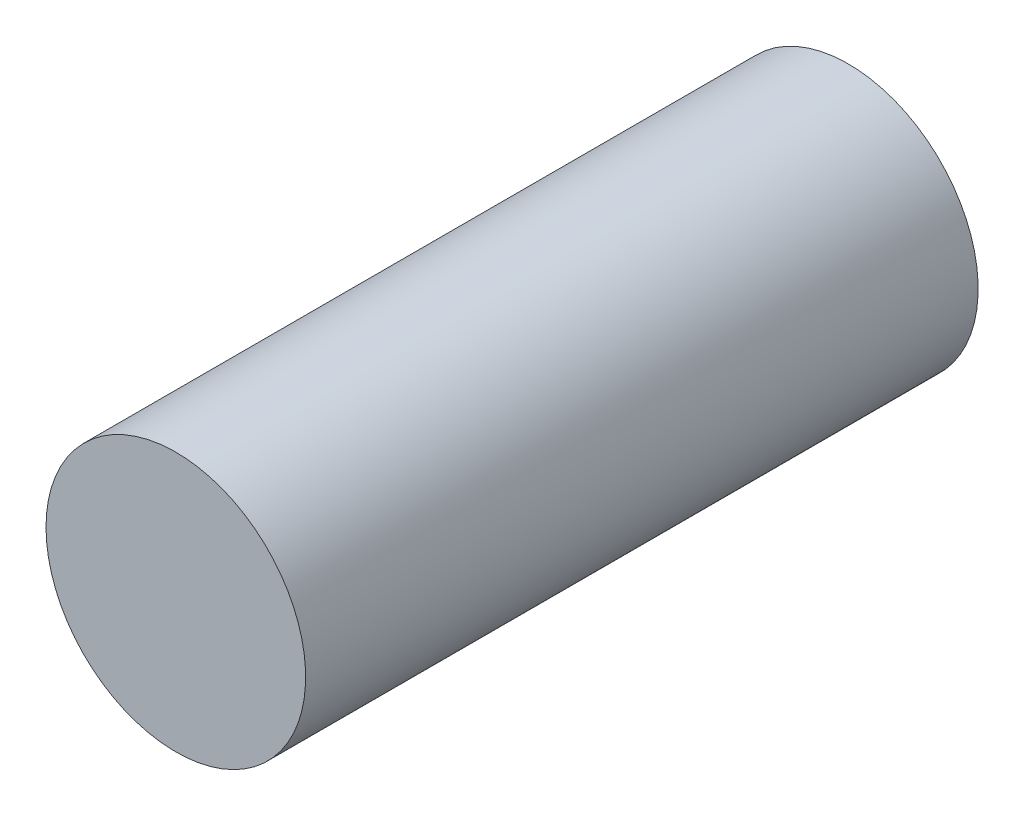
ISO-10303-21;
HEADER;
FILE_DESCRIPTION(('STEP AP214'),'2;1');
FILE_NAME('part.step','',(''),(''),'','','');
FILE_SCHEMA(('AUTOMOTIVE_DESIGN { 1 0 10303 214 1 1 1 1 }'));
ENDSEC;
DATA;
#1=APPLICATION_CONTEXT('core data for automotive mechanical design processes');
#2=APPLICATION_PROTOCOL_DEFINITION('international standard','automotive_design',2000,#1);
#3=PRODUCT_CONTEXT('',#1,'mechanical');
#4=PRODUCT('Part','Part','',(#3));
#5=PRODUCT_RELATED_PRODUCT_CATEGORY('part','',(#4));
#6=PRODUCT_DEFINITION_FORMATION('','',#4);
#7=PRODUCT_DEFINITION_CONTEXT('part definition',#1,'design');
#8=PRODUCT_DEFINITION('design','',#6,#7);
#9=PRODUCT_DEFINITION_SHAPE('','',#8);
#10=(LENGTH_UNIT() NAMED_UNIT(*) SI_UNIT(.MILLI.,.METRE.));
#11=(NAMED_UNIT(*) PLANE_ANGLE_UNIT() SI_UNIT($,.RADIAN.));
#12=(NAMED_UNIT(*) SI_UNIT($,.STERADIAN.) SOLID_ANGLE_UNIT());
#13=UNCERTAINTY_MEASURE_WITH_UNIT(LENGTH_MEASURE(1.E-05),#10,'distance_accuracy_value','');
#14=(GEOMETRIC_REPRESENTATION_CONTEXT(3) GLOBAL_UNCERTAINTY_ASSIGNED_CONTEXT((#13)) GLOBAL_UNIT_ASSIGNED_CONTEXT((#10,
#11,#12)) REPRESENTATION_CONTEXT('',''));
#15=CARTESIAN_POINT('',(0.,0.,0.));
#16=DIRECTION('',(0.,0.,1.));
#17=DIRECTION('',(1.,0.,0.));
#18=AXIS2_PLACEMENT_3D('',#15,#16,#17);
#19=CARTESIAN_POINT('',(0.,0.,51.8));
#20=DIRECTION('',(0.,0.,-1.));
#21=DIRECTION('',(-1.,0.,0.));
#22=AXIS2_PLACEMENT_3D('',#19,#20,#21);
#23=CYLINDRICAL_SURFACE('',#22,10.);
#24=CARTESIAN_POINT('',(0.,0.,51.8));
#25=DIRECTION('',(0.,0.,1.));
#26=DIRECTION('',(1.,0.,0.));
#27=AXIS2_PLACEMENT_3D('',#24,#25,#26);
#28=CIRCLE('',#27,10.);
#29=CARTESIAN_POINT('',(-10.,0.,51.8));
#30=VERTEX_POINT('',#29);
#31=EDGE_CURVE('E10',#30,#30,#28,.T.);
#32=CARTESIAN_POINT('',(0.,0.,0.));
#33=DIRECTION('',(0.,0.,1.));
#34=DIRECTION('',(1.,0.,0.));
#35=AXIS2_PLACEMENT_3D('',#32,#33,#34);
#36=CIRCLE('',#35,10.);
#37=CARTESIAN_POINT('',(-10.,0.,0.));
#38=VERTEX_POINT('',#37);
#39=EDGE_CURVE('E46',#38,#38,#36,.T.);
#40=CARTESIAN_POINT('',(-10.,0.,51.8));
#41=CARTESIAN_POINT('',(-10.,0.,51.2604166666667));
#42=CARTESIAN_POINT('',(-10.,0.,50.7208333333333));
#43=CARTESIAN_POINT('',(-10.,0.,49.6416666666667));
#44=CARTESIAN_POINT('',(-10.,0.,49.1020833333333));
#45=CARTESIAN_POINT('',(-10.,0.,48.0229166666667));
#46=CARTESIAN_POINT('',(-10.,0.,47.4833333333333));
#47=CARTESIAN_POINT('',(-10.,0.,46.4041666666667));
#48=CARTESIAN_POINT('',(-10.,0.,45.8645833333333));
#49=CARTESIAN_POINT('',(-10.,0.,44.7854166666667));
#50=CARTESIAN_POINT('',(-10.,0.,44.2458333333333));
#51=CARTESIAN_POINT('',(-10.,0.,43.1666666666667));
#52=CARTESIAN_POINT('',(-10.,0.,42.6270833333333));
#53=CARTESIAN_POINT('',(-10.,0.,41.5479166666667));
#54=CARTESIAN_POINT('',(-10.,0.,41.0083333333333));
#55=CARTESIAN_POINT('',(-10.,0.,39.9291666666667));
#56=CARTESIAN_POINT('',(-10.,0.,39.3895833333333));
#57=CARTESIAN_POINT('',(-10.,0.,38.3104166666667));
#58=CARTESIAN_POINT('',(-10.,0.,37.7708333333333));
#59=CARTESIAN_POINT('',(-10.,0.,36.6916666666667));
#60=CARTESIAN_POINT('',(-10.,0.,36.1520833333333));
#61=CARTESIAN_POINT('',(-10.,0.,35.0729166666667));
#62=CARTESIAN_POINT('',(-10.,0.,34.5333333333333));
#63=CARTESIAN_POINT('',(-10.,0.,33.4541666666667));
#64=CARTESIAN_POINT('',(-10.,0.,32.9145833333333));
#65=CARTESIAN_POINT('',(-10.,0.,31.8354166666667));
#66=CARTESIAN_POINT('',(-10.,0.,31.2958333333333));
#67=CARTESIAN_POINT('',(-10.,0.,30.2166666666667));
#68=CARTESIAN_POINT('',(-10.,0.,29.6770833333333));
#69=CARTESIAN_POINT('',(-10.,0.,28.5979166666667));
#70=CARTESIAN_POINT('',(-10.,0.,28.0583333333333));
#71=CARTESIAN_POINT('',(-10.,0.,26.9791666666667));
#72=CARTESIAN_POINT('',(-10.,0.,26.4395833333333));
#73=CARTESIAN_POINT('',(-10.,0.,25.3604166666667));
#74=CARTESIAN_POINT('',(-10.,0.,24.8208333333333));
#75=CARTESIAN_POINT('',(-10.,0.,23.7416666666667));
#76=CARTESIAN_POINT('',(-10.,0.,23.2020833333333));
#77=CARTESIAN_POINT('',(-10.,0.,22.1229166666667));
#78=CARTESIAN_POINT('',(-10.,0.,21.5833333333333));
#79=CARTESIAN_POINT('',(-10.,0.,20.5041666666667));
#80=CARTESIAN_POINT('',(-10.,0.,19.9645833333333));
#81=CARTESIAN_POINT('',(-10.,0.,18.8854166666667));
#82=CARTESIAN_POINT('',(-10.,0.,18.3458333333333));
#83=CARTESIAN_POINT('',(-10.,0.,17.2666666666667));
#84=CARTESIAN_POINT('',(-10.,0.,16.7270833333333));
#85=CARTESIAN_POINT('',(-10.,0.,15.6479166666667));
#86=CARTESIAN_POINT('',(-10.,0.,15.1083333333333));
#87=CARTESIAN_POINT('',(-10.,0.,14.0291666666667));
#88=CARTESIAN_POINT('',(-10.,0.,13.4895833333333));
#89=CARTESIAN_POINT('',(-10.,0.,12.4104166666667));
#90=CARTESIAN_POINT('',(-10.,0.,11.8708333333333));
#91=CARTESIAN_POINT('',(-10.,0.,10.7916666666667));
#92=CARTESIAN_POINT('',(-10.,0.,10.2520833333333));
#93=CARTESIAN_POINT('',(-10.,0.,9.17291666666666));
#94=CARTESIAN_POINT('',(-10.,0.,8.63333333333333));
#95=CARTESIAN_POINT('',(-10.,0.,7.55416666666666));
#96=CARTESIAN_POINT('',(-10.,0.,7.01458333333333));
#97=CARTESIAN_POINT('',(-10.,0.,5.93541666666666));
#98=CARTESIAN_POINT('',(-10.,0.,5.39583333333333));
#99=CARTESIAN_POINT('',(-10.,0.,4.31666666666666));
#100=CARTESIAN_POINT('',(-10.,0.,3.77708333333333));
#101=CARTESIAN_POINT('',(-10.,0.,2.69791666666666));
#102=CARTESIAN_POINT('',(-10.,0.,2.15833333333333));
#103=CARTESIAN_POINT('',(-10.,0.,1.07916666666666));
#104=CARTESIAN_POINT('',(-10.,0.,0.539583333333327));
#105=CARTESIAN_POINT('',(-10.,0.,0.));
#106=B_SPLINE_CURVE_WITH_KNOTS('',3,(#40,#41,#42,#43,#44,#45,#46,#47,#48,#49,#50,#51,#52,#53,
#54,#55,#56,#57,#58,#59,#60,#61,#62,#63,#64,#65,#66,#67,#68,#69,#70,#71,#72,#73,#74,#75,#76,#77,
#78,#79,#80,#81,#82,#83,#84,#85,#86,#87,#88,#89,#90,#91,#92,#93,#94,#95,#96,#97,#98,#99,#100,
#101,#102,#103,#104,#105),.UNSPECIFIED.,.F.,.F.,(4,2,2,2,2,2,2,2,2,2,2,2,2,2,2,2,2,2,2,2,2,2,2,
2,2,2,2,2,2,2,2,2,4),(0.,1.61875,3.2375,4.85625000000001,6.475,8.09375,9.71250000000001,
11.33125,12.95,14.56875,16.1875,17.80625,19.425,21.04375,22.6625,24.28125,25.9,27.51875,29.1375,
30.75625,32.375,33.99375,35.6125,37.23125,38.85,40.46875,42.0875,43.70625,45.325,46.94375,
48.5625,50.18125,51.8),.UNSPECIFIED.);
#107=EDGE_CURVE('BSEAM43',#30,#38,#106,.T.);
#108=ORIENTED_EDGE('',*,*,#31,.F.);
#109=ORIENTED_EDGE('',*,*,#39,.T.);
#110=ORIENTED_EDGE('',*,*,#107,.T.);
#111=ORIENTED_EDGE('',*,*,#107,.F.);
#112=EDGE_LOOP('',(#108,#110,#109,#111));
#113=FACE_BOUND('',#112,.T.);
#114=ADVANCED_FACE('F43',(#113),#23,.T.);
#115=CARTESIAN_POINT('',(0.,0.,51.8));
#116=DIRECTION('',(0.,0.,1.));
#117=DIRECTION('',(1.,0.,0.));
#118=AXIS2_PLACEMENT_3D('',#115,#116,#117);
#119=PLANE('',#118);
#120=ORIENTED_EDGE('',*,*,#31,.T.);
#121=EDGE_LOOP('',(#120));
#122=FACE_BOUND('',#121,.T.);
#123=ADVANCED_FACE('F60',(#122),#119,.T.);
#124=CARTESIAN_POINT('',(0.,0.,0.));
#125=DIRECTION('',(0.,0.,1.));
#126=DIRECTION('',(1.,0.,0.));
#127=AXIS2_PLACEMENT_3D('',#124,#125,#126);
#128=PLANE('',#127);
#129=ORIENTED_EDGE('',*,*,#39,.F.);
#130=EDGE_LOOP('',(#129));
#131=FACE_BOUND('',#130,.T.);
#132=ADVANCED_FACE('F58',(#131),#128,.F.);
#133=CLOSED_SHELL('',(#114,#123,#132));
#134=MANIFOLD_SOLID_BREP('B2',#133);
#135=ADVANCED_BREP_SHAPE_REPRESENTATION('',(#18,#134),#14);
#136=SHAPE_DEFINITION_REPRESENTATION(#9,#135);
ENDSEC;
END-ISO-10303-21;
